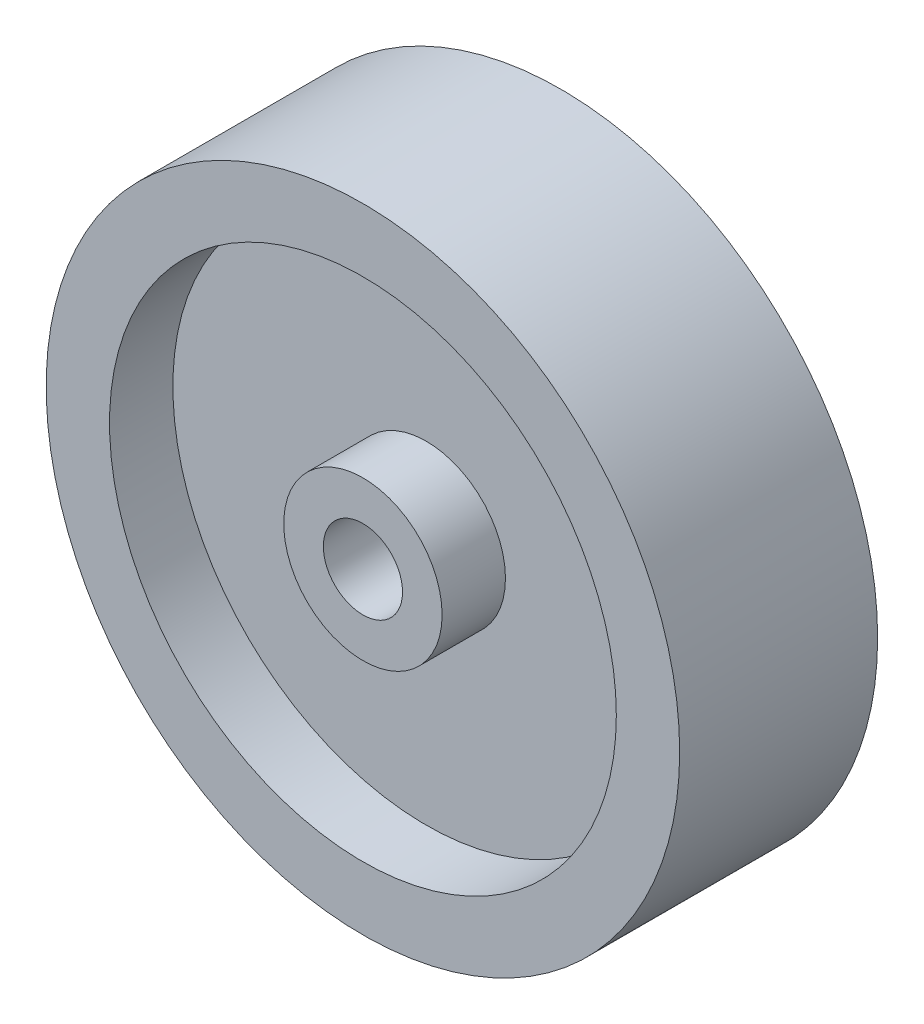
ISO-10303-21;
HEADER;
FILE_DESCRIPTION(('STEP AP214'),'2;1');
FILE_NAME('part.step','',(''),(''),'','','');
FILE_SCHEMA(('AUTOMOTIVE_DESIGN { 1 0 10303 214 1 1 1 1 }'));
ENDSEC;
DATA;
#1=APPLICATION_CONTEXT('core data for automotive mechanical design processes');
#2=APPLICATION_PROTOCOL_DEFINITION('international standard','automotive_design',2000,#1);
#3=PRODUCT_CONTEXT('',#1,'mechanical');
#4=PRODUCT('Part','Part','',(#3));
#5=PRODUCT_RELATED_PRODUCT_CATEGORY('part','',(#4));
#6=PRODUCT_DEFINITION_FORMATION('','',#4);
#7=PRODUCT_DEFINITION_CONTEXT('part definition',#1,'design');
#8=PRODUCT_DEFINITION('design','',#6,#7);
#9=PRODUCT_DEFINITION_SHAPE('','',#8);
#10=(LENGTH_UNIT() NAMED_UNIT(*) SI_UNIT(.MILLI.,.METRE.));
#11=(NAMED_UNIT(*) PLANE_ANGLE_UNIT() SI_UNIT($,.RADIAN.));
#12=(NAMED_UNIT(*) SI_UNIT($,.STERADIAN.) SOLID_ANGLE_UNIT());
#13=UNCERTAINTY_MEASURE_WITH_UNIT(LENGTH_MEASURE(1.E-05),#10,'distance_accuracy_value','');
#14=(GEOMETRIC_REPRESENTATION_CONTEXT(3) GLOBAL_UNCERTAINTY_ASSIGNED_CONTEXT((#13)) GLOBAL_UNIT_ASSIGNED_CONTEXT((#10,
#11,#12)) REPRESENTATION_CONTEXT('',''));
#15=CARTESIAN_POINT('',(0.,0.,0.));
#16=DIRECTION('',(0.,0.,1.));
#17=DIRECTION('',(1.,0.,0.));
#18=AXIS2_PLACEMENT_3D('',#15,#16,#17);
#19=CARTESIAN_POINT('',(0.,0.,-15.875));
#20=DIRECTION('',(0.,0.,1.));
#21=DIRECTION('',(1.,0.,0.));
#22=AXIS2_PLACEMENT_3D('',#19,#20,#21);
#23=PLANE('',#22);
#24=CARTESIAN_POINT('',(0.,0.,-15.875));
#25=DIRECTION('',(0.,0.,1.));
#26=DIRECTION('',(1.,0.,0.));
#27=AXIS2_PLACEMENT_3D('',#24,#25,#26);
#28=CIRCLE('',#27,6.35);
#29=CARTESIAN_POINT('',(6.35,0.,-15.875));
#30=VERTEX_POINT('',#29);
#31=EDGE_CURVE('E57',#30,#30,#28,.T.);
#32=ORIENTED_EDGE('',*,*,#31,.T.);
#33=EDGE_LOOP('',(#32));
#34=FACE_BOUND('',#33,.T.);
#35=CARTESIAN_POINT('',(0.,0.,-15.875));
#36=DIRECTION('',(0.,0.,1.));
#37=DIRECTION('',(1.,0.,0.));
#38=AXIS2_PLACEMENT_3D('',#35,#36,#37);
#39=CIRCLE('',#38,12.7);
#40=CARTESIAN_POINT('',(12.7,0.,-15.875));
#41=VERTEX_POINT('',#40);
#42=EDGE_CURVE('E83',#41,#41,#39,.T.);
#43=ORIENTED_EDGE('',*,*,#42,.F.);
#44=EDGE_LOOP('',(#43));
#45=FACE_BOUND('',#44,.T.);
#46=ADVANCED_FACE('F46',(#34,#45),#23,.F.);
#47=CARTESIAN_POINT('',(0.,0.,15.875));
#48=DIRECTION('',(0.,0.,1.));
#49=DIRECTION('',(1.,0.,0.));
#50=AXIS2_PLACEMENT_3D('',#47,#48,#49);
#51=PLANE('',#50);
#52=CARTESIAN_POINT('',(0.,0.,15.875));
#53=DIRECTION('',(0.,0.,1.));
#54=DIRECTION('',(1.,0.,0.));
#55=AXIS2_PLACEMENT_3D('',#52,#53,#54);
#56=CIRCLE('',#55,6.35);
#57=CARTESIAN_POINT('',(6.35,0.,15.875));
#58=VERTEX_POINT('',#57);
#59=EDGE_CURVE('E59',#58,#58,#56,.T.);
#60=ORIENTED_EDGE('',*,*,#59,.F.);
#61=EDGE_LOOP('',(#60));
#62=FACE_BOUND('',#61,.T.);
#63=CARTESIAN_POINT('',(0.,0.,15.875));
#64=DIRECTION('',(0.,0.,1.));
#65=DIRECTION('',(1.,0.,0.));
#66=AXIS2_PLACEMENT_3D('',#63,#64,#65);
#67=CIRCLE('',#66,12.7);
#68=CARTESIAN_POINT('',(12.7,0.,15.875));
#69=VERTEX_POINT('',#68);
#70=EDGE_CURVE('E71',#69,#69,#67,.T.);
#71=ORIENTED_EDGE('',*,*,#70,.T.);
#72=EDGE_LOOP('',(#71));
#73=FACE_BOUND('',#72,.T.);
#74=ADVANCED_FACE('F99',(#62,#73),#51,.T.);
#75=CARTESIAN_POINT('',(0.,0.,-15.875));
#76=DIRECTION('',(0.,0.,1.));
#77=DIRECTION('',(1.,0.,0.));
#78=AXIS2_PLACEMENT_3D('',#75,#76,#77);
#79=CYLINDRICAL_SURFACE('',#78,50.8);
#80=CARTESIAN_POINT('',(0.,0.,-15.875));
#81=DIRECTION('',(0.,0.,1.));
#82=DIRECTION('',(1.,0.,0.));
#83=AXIS2_PLACEMENT_3D('',#80,#81,#82);
#84=CIRCLE('',#83,50.8);
#85=CARTESIAN_POINT('',(50.8,0.,-15.875));
#86=VERTEX_POINT('',#85);
#87=EDGE_CURVE('E12',#86,#86,#84,.T.);
#88=ORIENTED_EDGE('',*,*,#87,.T.);
#89=EDGE_LOOP('',(#88));
#90=FACE_BOUND('',#89,.T.);
#91=CARTESIAN_POINT('',(0.,0.,15.875));
#92=DIRECTION('',(0.,0.,1.));
#93=DIRECTION('',(1.,0.,0.));
#94=AXIS2_PLACEMENT_3D('',#91,#92,#93);
#95=CIRCLE('',#94,50.8);
#96=CARTESIAN_POINT('',(50.8,0.,15.875));
#97=VERTEX_POINT('',#96);
#98=EDGE_CURVE('E50',#97,#97,#95,.T.);
#99=ORIENTED_EDGE('',*,*,#98,.F.);
#100=EDGE_LOOP('',(#99));
#101=FACE_BOUND('',#100,.T.);
#102=ADVANCED_FACE('F48',(#90,#101),#79,.T.);
#103=CARTESIAN_POINT('',(0.,0.,-15.875));
#104=DIRECTION('',(0.,0.,1.));
#105=DIRECTION('',(1.,0.,0.));
#106=AXIS2_PLACEMENT_3D('',#103,#104,#105);
#107=CIRCLE('',#106,40.64);
#108=CARTESIAN_POINT('',(40.64,0.,-15.875));
#109=VERTEX_POINT('',#108);
#110=EDGE_CURVE('E77',#109,#109,#107,.T.);
#111=ORIENTED_EDGE('',*,*,#110,.T.);
#112=EDGE_LOOP('',(#111));
#113=FACE_BOUND('',#112,.T.);
#114=ORIENTED_EDGE('',*,*,#87,.F.);
#115=EDGE_LOOP('',(#114));
#116=FACE_BOUND('',#115,.T.);
#117=ADVANCED_FACE('F102',(#113,#116),#23,.F.);
#118=CARTESIAN_POINT('',(0.,0.,15.875));
#119=DIRECTION('',(0.,0.,1.));
#120=DIRECTION('',(1.,0.,0.));
#121=AXIS2_PLACEMENT_3D('',#118,#119,#120);
#122=CIRCLE('',#121,40.64);
#123=CARTESIAN_POINT('',(40.64,0.,15.875));
#124=VERTEX_POINT('',#123);
#125=EDGE_CURVE('E65',#124,#124,#122,.T.);
#126=ORIENTED_EDGE('',*,*,#125,.F.);
#127=EDGE_LOOP('',(#126));
#128=FACE_BOUND('',#127,.T.);
#129=ORIENTED_EDGE('',*,*,#98,.T.);
#130=EDGE_LOOP('',(#129));
#131=FACE_BOUND('',#130,.T.);
#132=ADVANCED_FACE('F107',(#128,#131),#51,.T.);
#133=CARTESIAN_POINT('',(0.,0.,-15.875));
#134=DIRECTION('',(0.,0.,1.));
#135=DIRECTION('',(1.,0.,0.));
#136=AXIS2_PLACEMENT_3D('',#133,#134,#135);
#137=CYLINDRICAL_SURFACE('',#136,6.35);
#138=ORIENTED_EDGE('',*,*,#31,.F.);
#139=EDGE_LOOP('',(#138));
#140=FACE_BOUND('',#139,.T.);
#141=ORIENTED_EDGE('',*,*,#59,.T.);
#142=EDGE_LOOP('',(#141));
#143=FACE_BOUND('',#142,.T.);
#144=ADVANCED_FACE('F115',(#140,#143),#137,.F.);
#145=CARTESIAN_POINT('',(0.,0.,5.715));
#146=DIRECTION('',(0.,0.,1.));
#147=DIRECTION('',(1.,0.,0.));
#148=AXIS2_PLACEMENT_3D('',#145,#146,#147);
#149=CYLINDRICAL_SURFACE('',#148,40.64);
#150=CARTESIAN_POINT('',(0.,0.,5.715));
#151=DIRECTION('',(0.,0.,1.));
#152=DIRECTION('',(1.,0.,0.));
#153=AXIS2_PLACEMENT_3D('',#150,#151,#152);
#154=CIRCLE('',#153,40.64);
#155=CARTESIAN_POINT('',(40.64,0.,5.715));
#156=VERTEX_POINT('',#155);
#157=EDGE_CURVE('E62',#156,#156,#154,.T.);
#158=ORIENTED_EDGE('',*,*,#157,.F.);
#159=EDGE_LOOP('',(#158));
#160=FACE_BOUND('',#159,.T.);
#161=ORIENTED_EDGE('',*,*,#125,.T.);
#162=EDGE_LOOP('',(#161));
#163=FACE_BOUND('',#162,.T.);
#164=ADVANCED_FACE('F136',(#160,#163),#149,.F.);
#165=CARTESIAN_POINT('',(0.,0.,5.715));
#166=DIRECTION('',(0.,0.,1.));
#167=DIRECTION('',(1.,0.,0.));
#168=AXIS2_PLACEMENT_3D('',#165,#166,#167);
#169=PLANE('',#168);
#170=CARTESIAN_POINT('',(0.,0.,5.715));
#171=DIRECTION('',(0.,0.,1.));
#172=DIRECTION('',(1.,0.,0.));
#173=AXIS2_PLACEMENT_3D('',#170,#171,#172);
#174=CIRCLE('',#173,12.7);
#175=CARTESIAN_POINT('',(12.7,0.,5.715));
#176=VERTEX_POINT('',#175);
#177=EDGE_CURVE('E68',#176,#176,#174,.T.);
#178=ORIENTED_EDGE('',*,*,#177,.F.);
#179=EDGE_LOOP('',(#178));
#180=FACE_BOUND('',#179,.T.);
#181=ORIENTED_EDGE('',*,*,#157,.T.);
#182=EDGE_LOOP('',(#181));
#183=FACE_BOUND('',#182,.T.);
#184=ADVANCED_FACE('F132',(#180,#183),#169,.T.);
#185=CARTESIAN_POINT('',(0.,0.,5.715));
#186=DIRECTION('',(0.,0.,1.));
#187=DIRECTION('',(1.,0.,0.));
#188=AXIS2_PLACEMENT_3D('',#185,#186,#187);
#189=CYLINDRICAL_SURFACE('',#188,12.7);
#190=ORIENTED_EDGE('',*,*,#177,.T.);
#191=EDGE_LOOP('',(#190));
#192=FACE_BOUND('',#191,.T.);
#193=ORIENTED_EDGE('',*,*,#70,.F.);
#194=EDGE_LOOP('',(#193));
#195=FACE_BOUND('',#194,.T.);
#196=ADVANCED_FACE('F126',(#192,#195),#189,.T.);
#197=CARTESIAN_POINT('',(0.,0.,-5.715));
#198=DIRECTION('',(0.,0.,-1.));
#199=DIRECTION('',(1.,0.,0.));
#200=AXIS2_PLACEMENT_3D('',#197,#198,#199);
#201=PLANE('',#200);
#202=CARTESIAN_POINT('',(0.,0.,-5.715));
#203=DIRECTION('',(0.,0.,1.));
#204=DIRECTION('',(1.,0.,0.));
#205=AXIS2_PLACEMENT_3D('',#202,#203,#204);
#206=CIRCLE('',#205,40.64);
#207=CARTESIAN_POINT('',(40.64,0.,-5.715));
#208=VERTEX_POINT('',#207);
#209=EDGE_CURVE('E74',#208,#208,#206,.T.);
#210=ORIENTED_EDGE('',*,*,#209,.F.);
#211=EDGE_LOOP('',(#210));
#212=FACE_BOUND('',#211,.T.);
#213=CARTESIAN_POINT('',(0.,0.,-5.715));
#214=DIRECTION('',(0.,0.,1.));
#215=DIRECTION('',(1.,0.,0.));
#216=AXIS2_PLACEMENT_3D('',#213,#214,#215);
#217=CIRCLE('',#216,12.7);
#218=CARTESIAN_POINT('',(12.7,0.,-5.715));
#219=VERTEX_POINT('',#218);
#220=EDGE_CURVE('E80',#219,#219,#217,.T.);
#221=ORIENTED_EDGE('',*,*,#220,.T.);
#222=EDGE_LOOP('',(#221));
#223=FACE_BOUND('',#222,.T.);
#224=ADVANCED_FACE('F89',(#212,#223),#201,.T.);
#225=CARTESIAN_POINT('',(0.,0.,-5.715));
#226=DIRECTION('',(0.,0.,-1.));
#227=DIRECTION('',(-1.,0.,0.));
#228=AXIS2_PLACEMENT_3D('',#225,#226,#227);
#229=CYLINDRICAL_SURFACE('',#228,40.64);
#230=ORIENTED_EDGE('',*,*,#209,.T.);
#231=EDGE_LOOP('',(#230));
#232=FACE_BOUND('',#231,.T.);
#233=ORIENTED_EDGE('',*,*,#110,.F.);
#234=EDGE_LOOP('',(#233));
#235=FACE_BOUND('',#234,.T.);
#236=ADVANCED_FACE('F94',(#232,#235),#229,.F.);
#237=CARTESIAN_POINT('',(0.,0.,-5.715));
#238=DIRECTION('',(0.,0.,-1.));
#239=DIRECTION('',(-1.,0.,0.));
#240=AXIS2_PLACEMENT_3D('',#237,#238,#239);
#241=CYLINDRICAL_SURFACE('',#240,12.7);
#242=ORIENTED_EDGE('',*,*,#220,.F.);
#243=EDGE_LOOP('',(#242));
#244=FACE_BOUND('',#243,.T.);
#245=ORIENTED_EDGE('',*,*,#42,.T.);
#246=EDGE_LOOP('',(#245));
#247=FACE_BOUND('',#246,.T.);
#248=ADVANCED_FACE('F91',(#244,#247),#241,.T.);
#249=CLOSED_SHELL('',(#46,#74,#102,#117,#132,#144,#164,#184,#196,#224,#236,#248));
#250=MANIFOLD_SOLID_BREP('B2',#249);
#251=ADVANCED_BREP_SHAPE_REPRESENTATION('',(#18,#250),#14);
#252=SHAPE_DEFINITION_REPRESENTATION(#9,#251);
ENDSEC;
END-ISO-10303-21;
